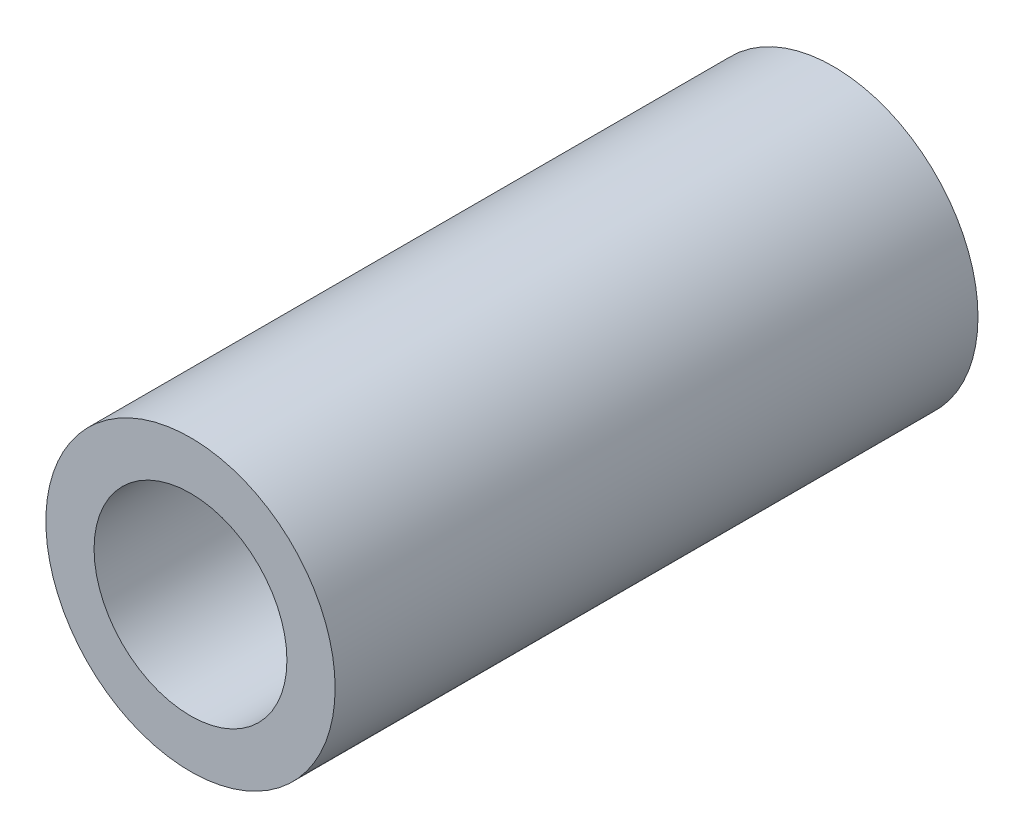
ISO-10303-21;
HEADER;
FILE_DESCRIPTION(('STEP AP214'),'2;1');
FILE_NAME('part.step','',(''),(''),'','','');
FILE_SCHEMA(('AUTOMOTIVE_DESIGN { 1 0 10303 214 1 1 1 1 }'));
ENDSEC;
DATA;
#1=APPLICATION_CONTEXT('core data for automotive mechanical design processes');
#2=APPLICATION_PROTOCOL_DEFINITION('international standard','automotive_design',2000,#1);
#3=PRODUCT_CONTEXT('',#1,'mechanical');
#4=PRODUCT('Part','Part','',(#3));
#5=PRODUCT_RELATED_PRODUCT_CATEGORY('part','',(#4));
#6=PRODUCT_DEFINITION_FORMATION('','',#4);
#7=PRODUCT_DEFINITION_CONTEXT('part definition',#1,'design');
#8=PRODUCT_DEFINITION('design','',#6,#7);
#9=PRODUCT_DEFINITION_SHAPE('','',#8);
#10=(LENGTH_UNIT() NAMED_UNIT(*) SI_UNIT(.MILLI.,.METRE.));
#11=(NAMED_UNIT(*) PLANE_ANGLE_UNIT() SI_UNIT($,.RADIAN.));
#12=(NAMED_UNIT(*) SI_UNIT($,.STERADIAN.) SOLID_ANGLE_UNIT());
#13=UNCERTAINTY_MEASURE_WITH_UNIT(LENGTH_MEASURE(1.E-05),#10,'distance_accuracy_value','');
#14=(GEOMETRIC_REPRESENTATION_CONTEXT(3) GLOBAL_UNCERTAINTY_ASSIGNED_CONTEXT((#13)) GLOBAL_UNIT_ASSIGNED_CONTEXT((#10,
#11,#12)) REPRESENTATION_CONTEXT('',''));
#15=CARTESIAN_POINT('',(0.,0.,0.));
#16=DIRECTION('',(0.,0.,1.));
#17=DIRECTION('',(1.,0.,0.));
#18=AXIS2_PLACEMENT_3D('',#15,#16,#17);
#19=CARTESIAN_POINT('',(0.,0.,10.));
#20=DIRECTION('',(0.,0.,1.));
#21=DIRECTION('',(1.,0.,0.));
#22=AXIS2_PLACEMENT_3D('',#19,#20,#21);
#23=PLANE('',#22);
#24=CARTESIAN_POINT('',(0.,0.,10.));
#25=DIRECTION('',(0.,0.,1.));
#26=DIRECTION('',(1.,0.,0.));
#27=AXIS2_PLACEMENT_3D('',#24,#25,#26);
#28=CIRCLE('',#27,2.25);
#29=CARTESIAN_POINT('',(2.25,0.,10.));
#30=VERTEX_POINT('',#29);
#31=EDGE_CURVE('E10',#30,#30,#28,.T.);
#32=ORIENTED_EDGE('',*,*,#31,.T.);
#33=EDGE_LOOP('',(#32));
#34=FACE_BOUND('',#33,.T.);
#35=CARTESIAN_POINT('',(0.,0.,10.));
#36=DIRECTION('',(0.,0.,1.));
#37=DIRECTION('',(1.,0.,0.));
#38=AXIS2_PLACEMENT_3D('',#35,#36,#37);
#39=CIRCLE('',#38,1.5);
#40=CARTESIAN_POINT('',(1.5,0.,10.));
#41=VERTEX_POINT('',#40);
#42=EDGE_CURVE('E50',#41,#41,#39,.T.);
#43=ORIENTED_EDGE('',*,*,#42,.F.);
#44=EDGE_LOOP('',(#43));
#45=FACE_BOUND('',#44,.T.);
#46=ADVANCED_FACE('F37',(#34,#45),#23,.T.);
#47=CARTESIAN_POINT('',(0.,0.,0.));
#48=DIRECTION('',(0.,0.,1.));
#49=DIRECTION('',(1.,0.,0.));
#50=AXIS2_PLACEMENT_3D('',#47,#48,#49);
#51=PLANE('',#50);
#52=CARTESIAN_POINT('',(0.,0.,0.));
#53=DIRECTION('',(0.,0.,1.));
#54=DIRECTION('',(1.,0.,0.));
#55=AXIS2_PLACEMENT_3D('',#52,#53,#54);
#56=CIRCLE('',#55,2.25);
#57=CARTESIAN_POINT('',(2.25,0.,0.));
#58=VERTEX_POINT('',#57);
#59=EDGE_CURVE('E41',#58,#58,#56,.T.);
#60=ORIENTED_EDGE('',*,*,#59,.F.);
#61=EDGE_LOOP('',(#60));
#62=FACE_BOUND('',#61,.T.);
#63=CARTESIAN_POINT('',(0.,0.,0.));
#64=DIRECTION('',(0.,0.,1.));
#65=DIRECTION('',(1.,0.,0.));
#66=AXIS2_PLACEMENT_3D('',#63,#64,#65);
#67=CIRCLE('',#66,1.5);
#68=CARTESIAN_POINT('',(1.5,0.,0.));
#69=VERTEX_POINT('',#68);
#70=EDGE_CURVE('E52',#69,#69,#67,.T.);
#71=ORIENTED_EDGE('',*,*,#70,.T.);
#72=EDGE_LOOP('',(#71));
#73=FACE_BOUND('',#72,.T.);
#74=ADVANCED_FACE('F64',(#62,#73),#51,.F.);
#75=CARTESIAN_POINT('',(0.,0.,10.));
#76=DIRECTION('',(0.,0.,-1.));
#77=DIRECTION('',(-1.,0.,0.));
#78=AXIS2_PLACEMENT_3D('',#75,#76,#77);
#79=CYLINDRICAL_SURFACE('',#78,2.25);
#80=ORIENTED_EDGE('',*,*,#31,.F.);
#81=EDGE_LOOP('',(#80));
#82=FACE_BOUND('',#81,.T.);
#83=ORIENTED_EDGE('',*,*,#59,.T.);
#84=EDGE_LOOP('',(#83));
#85=FACE_BOUND('',#84,.T.);
#86=ADVANCED_FACE('F39',(#82,#85),#79,.T.);
#87=CARTESIAN_POINT('',(0.,0.,10.));
#88=DIRECTION('',(0.,0.,-1.));
#89=DIRECTION('',(-1.,0.,0.));
#90=AXIS2_PLACEMENT_3D('',#87,#88,#89);
#91=CYLINDRICAL_SURFACE('',#90,1.5);
#92=ORIENTED_EDGE('',*,*,#42,.T.);
#93=EDGE_LOOP('',(#92));
#94=FACE_BOUND('',#93,.T.);
#95=ORIENTED_EDGE('',*,*,#70,.F.);
#96=EDGE_LOOP('',(#95));
#97=FACE_BOUND('',#96,.T.);
#98=ADVANCED_FACE('F60',(#94,#97),#91,.F.);
#99=CLOSED_SHELL('',(#46,#74,#86,#98));
#100=MANIFOLD_SOLID_BREP('B2',#99);
#101=ADVANCED_BREP_SHAPE_REPRESENTATION('',(#18,#100),#14);
#102=SHAPE_DEFINITION_REPRESENTATION(#9,#101);
ENDSEC;
END-ISO-10303-21;
